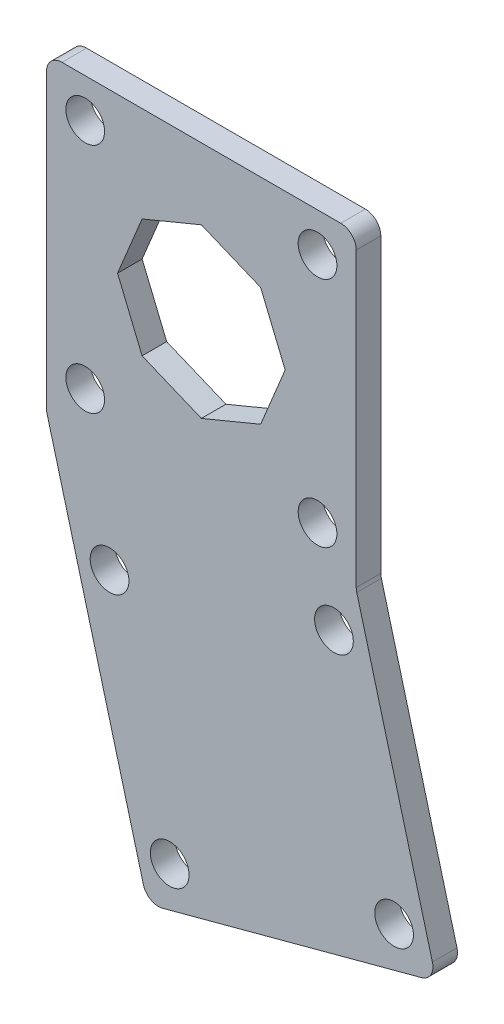
ISO-10303-21;
HEADER;
FILE_DESCRIPTION(('STEP AP214'),'2;1');
FILE_NAME('part.step','',(''),(''),'','','');
FILE_SCHEMA(('AUTOMOTIVE_DESIGN { 1 0 10303 214 1 1 1 1 }'));
ENDSEC;
DATA;
#1=APPLICATION_CONTEXT('core data for automotive mechanical design processes');
#2=APPLICATION_PROTOCOL_DEFINITION('international standard','automotive_design',2000,#1);
#3=PRODUCT_CONTEXT('',#1,'mechanical');
#4=PRODUCT('Part','Part','',(#3));
#5=PRODUCT_RELATED_PRODUCT_CATEGORY('part','',(#4));
#6=PRODUCT_DEFINITION_FORMATION('','',#4);
#7=PRODUCT_DEFINITION_CONTEXT('part definition',#1,'design');
#8=PRODUCT_DEFINITION('design','',#6,#7);
#9=PRODUCT_DEFINITION_SHAPE('','',#8);
#10=(LENGTH_UNIT() NAMED_UNIT(*) SI_UNIT(.MILLI.,.METRE.));
#11=(NAMED_UNIT(*) PLANE_ANGLE_UNIT() SI_UNIT($,.RADIAN.));
#12=(NAMED_UNIT(*) SI_UNIT($,.STERADIAN.) SOLID_ANGLE_UNIT());
#13=UNCERTAINTY_MEASURE_WITH_UNIT(LENGTH_MEASURE(1.E-05),#10,'distance_accuracy_value','');
#14=(GEOMETRIC_REPRESENTATION_CONTEXT(3) GLOBAL_UNCERTAINTY_ASSIGNED_CONTEXT((#13)) GLOBAL_UNIT_ASSIGNED_CONTEXT((#10,
#11,#12)) REPRESENTATION_CONTEXT('',''));
#15=CARTESIAN_POINT('',(0.,0.,0.));
#16=DIRECTION('',(0.,0.,1.));
#17=DIRECTION('',(1.,0.,0.));
#18=AXIS2_PLACEMENT_3D('',#15,#16,#17);
#19=CARTESIAN_POINT('',(0.,0.,3.175));
#20=DIRECTION('',(0.,0.,1.));
#21=DIRECTION('',(1.,0.,0.));
#22=AXIS2_PLACEMENT_3D('',#19,#20,#21);
#23=PLANE('',#22);
#24=CARTESIAN_POINT('',(-4.09047485359226,-62.6896895966552,3.175));
#25=DIRECTION('',(0.,0.,1.));
#26=DIRECTION('',(1.,0.,0.));
#27=AXIS2_PLACEMENT_3D('',#24,#25,#26);
#28=CIRCLE('',#27,2.5);
#29=CARTESIAN_POINT('',(-1.59047485359226,-62.6896895966552,3.175));
#30=VERTEX_POINT('',#29);
#31=EDGE_CURVE('E242',#30,#30,#28,.T.);
#32=ORIENTED_EDGE('',*,*,#31,.F.);
#33=EDGE_LOOP('',(#32));
#34=FACE_BOUND('',#33,.T.);
#35=CARTESIAN_POINT('',(17.1227285820042,-25.9473434549075,3.175));
#36=DIRECTION('',(0.,0.,1.));
#37=DIRECTION('',(1.,0.,0.));
#38=AXIS2_PLACEMENT_3D('',#35,#36,#37);
#39=CIRCLE('',#38,2.5);
#40=CARTESIAN_POINT('',(19.6227285820042,-25.9473434549075,3.175));
#41=VERTEX_POINT('',#40);
#42=EDGE_CURVE('E254',#41,#41,#39,.T.);
#43=ORIENTED_EDGE('',*,*,#42,.F.);
#44=EDGE_LOOP('',(#43));
#45=FACE_BOUND('',#44,.T.);
#46=CARTESIAN_POINT('',(15.,15.,3.175));
#47=DIRECTION('',(0.,0.,1.));
#48=DIRECTION('',(1.,0.,0.));
#49=AXIS2_PLACEMENT_3D('',#46,#47,#48);
#50=CIRCLE('',#49,2.5);
#51=CARTESIAN_POINT('',(17.5,15.,3.175));
#52=VERTEX_POINT('',#51);
#53=EDGE_CURVE('E266',#52,#52,#50,.T.);
#54=ORIENTED_EDGE('',*,*,#53,.F.);
#55=EDGE_LOOP('',(#54));
#56=FACE_BOUND('',#55,.T.);
#57=CARTESIAN_POINT('',(-15.,15.,3.175));
#58=DIRECTION('',(0.,0.,1.));
#59=DIRECTION('',(1.,0.,0.));
#60=AXIS2_PLACEMENT_3D('',#57,#58,#59);
#61=CIRCLE('',#60,2.5);
#62=CARTESIAN_POINT('',(-12.5,15.,3.175));
#63=VERTEX_POINT('',#62);
#64=EDGE_CURVE('E278',#63,#63,#61,.T.);
#65=ORIENTED_EDGE('',*,*,#64,.F.);
#66=EDGE_LOOP('',(#65));
#67=FACE_BOUND('',#66,.T.);
#68=DIRECTION('',(0.965925826289069,0.258819045102519,0.));
#69=VECTOR('',#68,1.);
#70=CARTESIAN_POINT('',(-6.96774627158808,-68.6370330515627,3.175));
#71=LINE('',#70,#69);
#72=CARTESIAN_POINT('',(-5.03589461900994,-68.1193949613576,3.175));
#73=VERTEX_POINT('',#72);
#74=CARTESIAN_POINT('',(28.4209101515226,-59.1546711417678,3.175));
#75=VERTEX_POINT('',#74);
#76=EDGE_CURVE('E297',#73,#75,#71,.T.);
#77=ORIENTED_EDGE('',*,*,#76,.T.);
#78=CARTESIAN_POINT('',(27.9032720613175,-57.2228194891897,3.175));
#79=DIRECTION('',(0.,0.,1.));
#80=DIRECTION('',(1.,0.,0.));
#81=AXIS2_PLACEMENT_3D('',#78,#79,#80);
#82=CIRCLE('',#81,2.);
#83=CARTESIAN_POINT('',(29.8351237138957,-56.7051813989846,3.175));
#84=VERTEX_POINT('',#83);
#85=EDGE_CURVE('E349',#75,#84,#82,.T.);
#86=ORIENTED_EDGE('',*,*,#85,.T.);
#87=DIRECTION('',(-0.258819045102518,0.965925826289069,0.));
#88=VECTOR('',#87,1.);
#89=CARTESIAN_POINT('',(20.,-20.,3.175));
#90=LINE('',#89,#88);
#91=CARTESIAN_POINT('',(20.0681483474219,-20.2543330950303,3.175));
#92=VERTEX_POINT('',#91);
#93=EDGE_CURVE('E300',#84,#92,#90,.T.);
#94=ORIENTED_EDGE('',*,*,#93,.T.);
#95=CARTESIAN_POINT('',(22.,-19.7366950048252,3.175));
#96=DIRECTION('',(0.,0.,1.));
#97=DIRECTION('',(1.,0.,0.));
#98=AXIS2_PLACEMENT_3D('',#95,#96,#97);
#99=CIRCLE('',#98,2.);
#100=CARTESIAN_POINT('',(20.,-19.7366950048252,3.175));
#101=VERTEX_POINT('',#100);
#102=EDGE_CURVE('E11',#92,#101,#99,.F.);
#103=ORIENTED_EDGE('',*,*,#102,.T.);
#104=DIRECTION('',(0.,1.,0.));
#105=VECTOR('',#104,1.);
#106=CARTESIAN_POINT('',(20.,20.,3.175));
#107=LINE('',#106,#105);
#108=CARTESIAN_POINT('',(20.,18.,3.175));
#109=VERTEX_POINT('',#108);
#110=EDGE_CURVE('E303',#101,#109,#107,.T.);
#111=ORIENTED_EDGE('',*,*,#110,.T.);
#112=CARTESIAN_POINT('',(18.,18.,3.175));
#113=DIRECTION('',(0.,0.,1.));
#114=DIRECTION('',(1.,0.,0.));
#115=AXIS2_PLACEMENT_3D('',#112,#113,#114);
#116=CIRCLE('',#115,2.);
#117=CARTESIAN_POINT('',(18.,20.,3.175));
#118=VERTEX_POINT('',#117);
#119=EDGE_CURVE('E55',#109,#118,#116,.T.);
#120=ORIENTED_EDGE('',*,*,#119,.T.);
#121=DIRECTION('',(-1.,0.,0.));
#122=VECTOR('',#121,1.);
#123=CARTESIAN_POINT('',(-20.,20.,3.175));
#124=LINE('',#123,#122);
#125=CARTESIAN_POINT('',(-18.,20.,3.175));
#126=VERTEX_POINT('',#125);
#127=EDGE_CURVE('E305',#118,#126,#124,.T.);
#128=ORIENTED_EDGE('',*,*,#127,.T.);
#129=CARTESIAN_POINT('',(-18.,18.,3.175));
#130=DIRECTION('',(0.,0.,1.));
#131=DIRECTION('',(1.,0.,0.));
#132=AXIS2_PLACEMENT_3D('',#129,#130,#131);
#133=CIRCLE('',#132,2.);
#134=CARTESIAN_POINT('',(-20.,18.,3.175));
#135=VERTEX_POINT('',#134);
#136=EDGE_CURVE('E342',#126,#135,#133,.T.);
#137=ORIENTED_EDGE('',*,*,#136,.T.);
#138=DIRECTION('',(0.,-1.,0.));
#139=VECTOR('',#138,1.);
#140=CARTESIAN_POINT('',(-20.,20.,3.175));
#141=LINE('',#140,#139);
#142=CARTESIAN_POINT('',(-20.,-19.7366950048252,3.175));
#143=VERTEX_POINT('',#142);
#144=EDGE_CURVE('E290',#135,#143,#141,.T.);
#145=ORIENTED_EDGE('',*,*,#144,.T.);
#146=CARTESIAN_POINT('',(-18.,-19.7366950048252,3.175));
#147=DIRECTION('',(0.,0.,1.));
#148=DIRECTION('',(1.,0.,0.));
#149=AXIS2_PLACEMENT_3D('',#146,#147,#148);
#150=CIRCLE('',#149,2.);
#151=CARTESIAN_POINT('',(-19.9318516525781,-20.2543330950302,3.175));
#152=VERTEX_POINT('',#151);
#153=EDGE_CURVE('E345',#143,#152,#150,.T.);
#154=ORIENTED_EDGE('',*,*,#153,.T.);
#155=DIRECTION('',(0.258819045102518,-0.965925826289069,0.));
#156=VECTOR('',#155,1.);
#157=CARTESIAN_POINT('',(-20.,-20.,3.175));
#158=LINE('',#157,#156);
#159=CARTESIAN_POINT('',(-7.48538436179312,-66.7051813989845,3.175));
#160=VERTEX_POINT('',#159);
#161=EDGE_CURVE('E293',#152,#160,#158,.T.);
#162=ORIENTED_EDGE('',*,*,#161,.T.);
#163=CARTESIAN_POINT('',(-5.55353270921498,-66.1875433087795,3.175));
#164=DIRECTION('',(0.,0.,1.));
#165=DIRECTION('',(1.,0.,0.));
#166=AXIS2_PLACEMENT_3D('',#163,#164,#165);
#167=CIRCLE('',#166,2.);
#168=EDGE_CURVE('E347',#160,#73,#167,.T.);
#169=ORIENTED_EDGE('',*,*,#168,.T.);
#170=EDGE_LOOP('',(#77,#86,#94,#103,#111,#120,#128,#137,#145,#154,#162,#169));
#171=FACE_BOUND('',#170,.T.);
#172=CARTESIAN_POINT('',(-11.8550462066679,-33.7119148079831,3.175));
#173=DIRECTION('',(0.,0.,1.));
#174=DIRECTION('',(1.,0.,0.));
#175=AXIS2_PLACEMENT_3D('',#172,#173,#174);
#176=CIRCLE('',#175,2.5);
#177=CARTESIAN_POINT('',(-9.35504620666789,-33.7119148079831,3.175));
#178=VERTEX_POINT('',#177);
#179=EDGE_CURVE('E284',#178,#178,#176,.T.);
#180=ORIENTED_EDGE('',*,*,#179,.F.);
#181=EDGE_LOOP('',(#180));
#182=FACE_BOUND('',#181,.T.);
#183=CARTESIAN_POINT('',(-15.,-15.,3.175));
#184=DIRECTION('',(0.,0.,1.));
#185=DIRECTION('',(1.,0.,0.));
#186=AXIS2_PLACEMENT_3D('',#183,#184,#185);
#187=CIRCLE('',#186,2.5);
#188=CARTESIAN_POINT('',(-12.5,-15.,3.175));
#189=VERTEX_POINT('',#188);
#190=EDGE_CURVE('E272',#189,#189,#187,.T.);
#191=ORIENTED_EDGE('',*,*,#190,.F.);
#192=EDGE_LOOP('',(#191));
#193=FACE_BOUND('',#192,.T.);
#194=CARTESIAN_POINT('',(15.,-15.,3.175));
#195=DIRECTION('',(0.,0.,1.));
#196=DIRECTION('',(1.,0.,0.));
#197=AXIS2_PLACEMENT_3D('',#194,#195,#196);
#198=CIRCLE('',#197,2.5);
#199=CARTESIAN_POINT('',(17.5,-15.,3.175));
#200=VERTEX_POINT('',#199);
#201=EDGE_CURVE('E260',#200,#200,#198,.T.);
#202=ORIENTED_EDGE('',*,*,#201,.F.);
#203=EDGE_LOOP('',(#202));
#204=FACE_BOUND('',#203,.T.);
#205=CARTESIAN_POINT('',(24.8872999350798,-54.9251182435796,3.175));
#206=DIRECTION('',(0.,0.,1.));
#207=DIRECTION('',(1.,0.,0.));
#208=AXIS2_PLACEMENT_3D('',#205,#206,#207);
#209=CIRCLE('',#208,2.5);
#210=CARTESIAN_POINT('',(27.3872999350798,-54.9251182435796,3.175));
#211=VERTEX_POINT('',#210);
#212=EDGE_CURVE('E248',#211,#211,#209,.T.);
#213=ORIENTED_EDGE('',*,*,#212,.F.);
#214=EDGE_LOOP('',(#213));
#215=FACE_BOUND('',#214,.T.);
#216=DIRECTION('',(-0.382683432365096,0.923879532511284,0.));
#217=VECTOR('',#216,1.);
#218=CARTESIAN_POINT('',(10.8239220029239,0.,3.175));
#219=LINE('',#218,#217);
#220=CARTESIAN_POINT('',(10.8239220029239,0.,3.175));
#221=VERTEX_POINT('',#220);
#222=CARTESIAN_POINT('',(7.65366864730174,7.65366864730185,3.175));
#223=VERTEX_POINT('',#222);
#224=EDGE_CURVE('E182',#221,#223,#219,.T.);
#225=ORIENTED_EDGE('',*,*,#224,.F.);
#226=DIRECTION('',(0.382683432365084,0.923879532511289,0.));
#227=VECTOR('',#226,1.);
#228=CARTESIAN_POINT('',(7.65366864730184,-7.65366864730174,3.175));
#229=LINE('',#228,#227);
#230=CARTESIAN_POINT('',(7.65366864730184,-7.65366864730174,3.175));
#231=VERTEX_POINT('',#230);
#232=EDGE_CURVE('E172',#231,#221,#229,.T.);
#233=ORIENTED_EDGE('',*,*,#232,.F.);
#234=DIRECTION('',(0.923879532511284,0.382683432365096,0.));
#235=VECTOR('',#234,1.);
#236=CARTESIAN_POINT('',(0.,-10.8239220029239,3.175));
#237=LINE('',#236,#235);
#238=CARTESIAN_POINT('',(0.,-10.8239220029239,3.175));
#239=VERTEX_POINT('',#238);
#240=EDGE_CURVE('E208',#239,#231,#237,.T.);
#241=ORIENTED_EDGE('',*,*,#240,.F.);
#242=DIRECTION('',(0.923879532511289,-0.382683432365084,0.));
#243=VECTOR('',#242,1.);
#244=CARTESIAN_POINT('',(-7.65366864730175,-7.65366864730184,3.175));
#245=LINE('',#244,#243);
#246=CARTESIAN_POINT('',(-7.65366864730175,-7.65366864730184,3.175));
#247=VERTEX_POINT('',#246);
#248=EDGE_CURVE('E205',#247,#239,#245,.T.);
#249=ORIENTED_EDGE('',*,*,#248,.F.);
#250=DIRECTION('',(0.382683432365096,-0.923879532511284,0.));
#251=VECTOR('',#250,1.);
#252=CARTESIAN_POINT('',(-10.8239220029239,0.,3.175));
#253=LINE('',#252,#251);
#254=CARTESIAN_POINT('',(-10.8239220029239,0.,3.175));
#255=VERTEX_POINT('',#254);
#256=EDGE_CURVE('E203',#255,#247,#253,.T.);
#257=ORIENTED_EDGE('',*,*,#256,.F.);
#258=DIRECTION('',(-0.382683432365084,-0.923879532511289,0.));
#259=VECTOR('',#258,1.);
#260=CARTESIAN_POINT('',(-7.65366864730184,7.65366864730174,3.175));
#261=LINE('',#260,#259);
#262=CARTESIAN_POINT('',(-7.65366864730184,7.65366864730174,3.175));
#263=VERTEX_POINT('',#262);
#264=EDGE_CURVE('E201',#263,#255,#261,.T.);
#265=ORIENTED_EDGE('',*,*,#264,.F.);
#266=DIRECTION('',(-0.923879532511284,-0.382683432365096,0.));
#267=VECTOR('',#266,1.);
#268=CARTESIAN_POINT('',(0.,10.8239220029239,3.175));
#269=LINE('',#268,#267);
#270=CARTESIAN_POINT('',(0.,10.8239220029239,3.175));
#271=VERTEX_POINT('',#270);
#272=EDGE_CURVE('E197',#271,#263,#269,.T.);
#273=ORIENTED_EDGE('',*,*,#272,.F.);
#274=DIRECTION('',(-0.923879532511289,0.382683432365084,0.));
#275=VECTOR('',#274,1.);
#276=CARTESIAN_POINT('',(7.65366864730174,7.65366864730185,3.175));
#277=LINE('',#276,#275);
#278=EDGE_CURVE('E195',#223,#271,#277,.T.);
#279=ORIENTED_EDGE('',*,*,#278,.F.);
#280=EDGE_LOOP('',(#225,#233,#241,#249,#257,#265,#273,#279));
#281=FACE_BOUND('',#280,.T.);
#282=ADVANCED_FACE('F33',(#34,#45,#56,#67,#171,#182,#193,#204,#215,#281),#23,.T.);
#283=CARTESIAN_POINT('',(0.,0.,0.));
#284=DIRECTION('',(0.,0.,1.));
#285=DIRECTION('',(1.,0.,0.));
#286=AXIS2_PLACEMENT_3D('',#283,#284,#285);
#287=PLANE('',#286);
#288=CARTESIAN_POINT('',(-4.09047485359226,-62.6896895966552,0.));
#289=DIRECTION('',(0.,0.,1.));
#290=DIRECTION('',(1.,0.,0.));
#291=AXIS2_PLACEMENT_3D('',#288,#289,#290);
#292=CIRCLE('',#291,2.5);
#293=CARTESIAN_POINT('',(-1.59047485359226,-62.6896895966552,0.));
#294=VERTEX_POINT('',#293);
#295=EDGE_CURVE('E190',#294,#294,#292,.T.);
#296=ORIENTED_EDGE('',*,*,#295,.T.);
#297=EDGE_LOOP('',(#296));
#298=FACE_BOUND('',#297,.T.);
#299=CARTESIAN_POINT('',(17.1227285820042,-25.9473434549075,0.));
#300=DIRECTION('',(0.,0.,1.));
#301=DIRECTION('',(1.,0.,0.));
#302=AXIS2_PLACEMENT_3D('',#299,#300,#301);
#303=CIRCLE('',#302,2.5);
#304=CARTESIAN_POINT('',(19.6227285820042,-25.9473434549075,0.));
#305=VERTEX_POINT('',#304);
#306=EDGE_CURVE('E251',#305,#305,#303,.T.);
#307=ORIENTED_EDGE('',*,*,#306,.T.);
#308=EDGE_LOOP('',(#307));
#309=FACE_BOUND('',#308,.T.);
#310=CARTESIAN_POINT('',(15.,15.,0.));
#311=DIRECTION('',(0.,0.,1.));
#312=DIRECTION('',(1.,0.,0.));
#313=AXIS2_PLACEMENT_3D('',#310,#311,#312);
#314=CIRCLE('',#313,2.5);
#315=CARTESIAN_POINT('',(17.5,15.,0.));
#316=VERTEX_POINT('',#315);
#317=EDGE_CURVE('E263',#316,#316,#314,.T.);
#318=ORIENTED_EDGE('',*,*,#317,.T.);
#319=EDGE_LOOP('',(#318));
#320=FACE_BOUND('',#319,.T.);
#321=CARTESIAN_POINT('',(-15.,15.,0.));
#322=DIRECTION('',(0.,0.,1.));
#323=DIRECTION('',(1.,0.,0.));
#324=AXIS2_PLACEMENT_3D('',#321,#322,#323);
#325=CIRCLE('',#324,2.5);
#326=CARTESIAN_POINT('',(-12.5,15.,0.));
#327=VERTEX_POINT('',#326);
#328=EDGE_CURVE('E275',#327,#327,#325,.T.);
#329=ORIENTED_EDGE('',*,*,#328,.T.);
#330=EDGE_LOOP('',(#329));
#331=FACE_BOUND('',#330,.T.);
#332=DIRECTION('',(-0.258819045102518,0.965925826289069,0.));
#333=VECTOR('',#332,1.);
#334=CARTESIAN_POINT('',(20.,-20.,0.));
#335=LINE('',#334,#333);
#336=CARTESIAN_POINT('',(29.8351237138957,-56.7051813989846,0.));
#337=VERTEX_POINT('',#336);
#338=CARTESIAN_POINT('',(20.0681483474219,-20.2543330950303,0.));
#339=VERTEX_POINT('',#338);
#340=EDGE_CURVE('E316',#337,#339,#335,.T.);
#341=ORIENTED_EDGE('',*,*,#340,.F.);
#342=CARTESIAN_POINT('',(27.9032720613175,-57.2228194891897,0.));
#343=DIRECTION('',(0.,0.,1.));
#344=DIRECTION('',(1.,0.,0.));
#345=AXIS2_PLACEMENT_3D('',#342,#343,#344);
#346=CIRCLE('',#345,2.);
#347=CARTESIAN_POINT('',(28.4209101515226,-59.1546711417678,0.));
#348=VERTEX_POINT('',#347);
#349=EDGE_CURVE('E335',#337,#348,#346,.F.);
#350=ORIENTED_EDGE('',*,*,#349,.T.);
#351=DIRECTION('',(0.965925826289069,0.258819045102519,0.));
#352=VECTOR('',#351,1.);
#353=CARTESIAN_POINT('',(-6.96774627158808,-68.6370330515627,0.));
#354=LINE('',#353,#352);
#355=CARTESIAN_POINT('',(-5.03589461900994,-68.1193949613576,0.));
#356=VERTEX_POINT('',#355);
#357=EDGE_CURVE('E313',#356,#348,#354,.T.);
#358=ORIENTED_EDGE('',*,*,#357,.F.);
#359=CARTESIAN_POINT('',(-5.55353270921498,-66.1875433087795,0.));
#360=DIRECTION('',(0.,0.,1.));
#361=DIRECTION('',(1.,0.,0.));
#362=AXIS2_PLACEMENT_3D('',#359,#360,#361);
#363=CIRCLE('',#362,2.);
#364=CARTESIAN_POINT('',(-7.48538436179312,-66.7051813989845,0.));
#365=VERTEX_POINT('',#364);
#366=EDGE_CURVE('E333',#356,#365,#363,.F.);
#367=ORIENTED_EDGE('',*,*,#366,.T.);
#368=DIRECTION('',(0.258819045102518,-0.965925826289069,0.));
#369=VECTOR('',#368,1.);
#370=CARTESIAN_POINT('',(-20.,-20.,0.));
#371=LINE('',#370,#369);
#372=CARTESIAN_POINT('',(-19.9318516525781,-20.2543330950302,0.));
#373=VERTEX_POINT('',#372);
#374=EDGE_CURVE('E310',#373,#365,#371,.T.);
#375=ORIENTED_EDGE('',*,*,#374,.F.);
#376=CARTESIAN_POINT('',(-18.,-19.7366950048252,0.));
#377=DIRECTION('',(0.,0.,1.));
#378=DIRECTION('',(1.,0.,0.));
#379=AXIS2_PLACEMENT_3D('',#376,#377,#378);
#380=CIRCLE('',#379,2.);
#381=CARTESIAN_POINT('',(-20.,-19.7366950048252,0.));
#382=VERTEX_POINT('',#381);
#383=EDGE_CURVE('E331',#373,#382,#380,.F.);
#384=ORIENTED_EDGE('',*,*,#383,.T.);
#385=DIRECTION('',(0.,-1.,0.));
#386=VECTOR('',#385,1.);
#387=CARTESIAN_POINT('',(-20.,20.,0.));
#388=LINE('',#387,#386);
#389=CARTESIAN_POINT('',(-20.,18.,0.));
#390=VERTEX_POINT('',#389);
#391=EDGE_CURVE('E287',#390,#382,#388,.T.);
#392=ORIENTED_EDGE('',*,*,#391,.F.);
#393=CARTESIAN_POINT('',(-18.,18.,0.));
#394=DIRECTION('',(0.,0.,1.));
#395=DIRECTION('',(1.,0.,0.));
#396=AXIS2_PLACEMENT_3D('',#393,#394,#395);
#397=CIRCLE('',#396,2.);
#398=CARTESIAN_POINT('',(-18.,20.,0.));
#399=VERTEX_POINT('',#398);
#400=EDGE_CURVE('E327',#390,#399,#397,.F.);
#401=ORIENTED_EDGE('',*,*,#400,.T.);
#402=DIRECTION('',(-1.,0.,0.));
#403=VECTOR('',#402,1.);
#404=CARTESIAN_POINT('',(-20.,20.,0.));
#405=LINE('',#404,#403);
#406=CARTESIAN_POINT('',(18.,20.,0.));
#407=VERTEX_POINT('',#406);
#408=EDGE_CURVE('E294',#407,#399,#405,.T.);
#409=ORIENTED_EDGE('',*,*,#408,.F.);
#410=CARTESIAN_POINT('',(18.,18.,0.));
#411=DIRECTION('',(0.,0.,1.));
#412=DIRECTION('',(1.,0.,0.));
#413=AXIS2_PLACEMENT_3D('',#410,#411,#412);
#414=CIRCLE('',#413,2.);
#415=CARTESIAN_POINT('',(20.,18.,0.));
#416=VERTEX_POINT('',#415);
#417=EDGE_CURVE('E329',#407,#416,#414,.F.);
#418=ORIENTED_EDGE('',*,*,#417,.T.);
#419=DIRECTION('',(0.,1.,0.));
#420=VECTOR('',#419,1.);
#421=CARTESIAN_POINT('',(20.,20.,0.));
#422=LINE('',#421,#420);
#423=CARTESIAN_POINT('',(20.,-19.7366950048252,0.));
#424=VERTEX_POINT('',#423);
#425=EDGE_CURVE('E319',#424,#416,#422,.T.);
#426=ORIENTED_EDGE('',*,*,#425,.F.);
#427=CARTESIAN_POINT('',(22.,-19.7366950048252,0.));
#428=DIRECTION('',(0.,0.,1.));
#429=DIRECTION('',(1.,0.,0.));
#430=AXIS2_PLACEMENT_3D('',#427,#428,#429);
#431=CIRCLE('',#430,2.);
#432=EDGE_CURVE('E41',#424,#339,#431,.T.);
#433=ORIENTED_EDGE('',*,*,#432,.T.);
#434=EDGE_LOOP('',(#341,#350,#358,#367,#375,#384,#392,#401,#409,#418,#426,#433));
#435=FACE_BOUND('',#434,.T.);
#436=CARTESIAN_POINT('',(-11.8550462066679,-33.7119148079831,0.));
#437=DIRECTION('',(0.,0.,1.));
#438=DIRECTION('',(1.,0.,0.));
#439=AXIS2_PLACEMENT_3D('',#436,#437,#438);
#440=CIRCLE('',#439,2.5);
#441=CARTESIAN_POINT('',(-9.35504620666789,-33.7119148079831,0.));
#442=VERTEX_POINT('',#441);
#443=EDGE_CURVE('E281',#442,#442,#440,.T.);
#444=ORIENTED_EDGE('',*,*,#443,.T.);
#445=EDGE_LOOP('',(#444));
#446=FACE_BOUND('',#445,.T.);
#447=CARTESIAN_POINT('',(-15.,-15.,0.));
#448=DIRECTION('',(0.,0.,1.));
#449=DIRECTION('',(1.,0.,0.));
#450=AXIS2_PLACEMENT_3D('',#447,#448,#449);
#451=CIRCLE('',#450,2.5);
#452=CARTESIAN_POINT('',(-12.5,-15.,0.));
#453=VERTEX_POINT('',#452);
#454=EDGE_CURVE('E269',#453,#453,#451,.T.);
#455=ORIENTED_EDGE('',*,*,#454,.T.);
#456=EDGE_LOOP('',(#455));
#457=FACE_BOUND('',#456,.T.);
#458=CARTESIAN_POINT('',(15.,-15.,0.));
#459=DIRECTION('',(0.,0.,1.));
#460=DIRECTION('',(1.,0.,0.));
#461=AXIS2_PLACEMENT_3D('',#458,#459,#460);
#462=CIRCLE('',#461,2.5);
#463=CARTESIAN_POINT('',(17.5,-15.,0.));
#464=VERTEX_POINT('',#463);
#465=EDGE_CURVE('E257',#464,#464,#462,.T.);
#466=ORIENTED_EDGE('',*,*,#465,.T.);
#467=EDGE_LOOP('',(#466));
#468=FACE_BOUND('',#467,.T.);
#469=CARTESIAN_POINT('',(24.8872999350798,-54.9251182435796,0.));
#470=DIRECTION('',(0.,0.,1.));
#471=DIRECTION('',(1.,0.,0.));
#472=AXIS2_PLACEMENT_3D('',#469,#470,#471);
#473=CIRCLE('',#472,2.5);
#474=CARTESIAN_POINT('',(27.3872999350798,-54.9251182435796,0.));
#475=VERTEX_POINT('',#474);
#476=EDGE_CURVE('E245',#475,#475,#473,.T.);
#477=ORIENTED_EDGE('',*,*,#476,.T.);
#478=EDGE_LOOP('',(#477));
#479=FACE_BOUND('',#478,.T.);
#480=DIRECTION('',(0.382683432365084,0.923879532511289,0.));
#481=VECTOR('',#480,1.);
#482=CARTESIAN_POINT('',(7.65366864730184,-7.65366864730174,0.));
#483=LINE('',#482,#481);
#484=CARTESIAN_POINT('',(7.65366864730184,-7.65366864730174,0.));
#485=VERTEX_POINT('',#484);
#486=CARTESIAN_POINT('',(10.8239220029239,0.,0.));
#487=VERTEX_POINT('',#486);
#488=EDGE_CURVE('E210',#485,#487,#483,.T.);
#489=ORIENTED_EDGE('',*,*,#488,.T.);
#490=DIRECTION('',(-0.382683432365096,0.923879532511284,0.));
#491=VECTOR('',#490,1.);
#492=CARTESIAN_POINT('',(10.8239220029239,0.,0.));
#493=LINE('',#492,#491);
#494=CARTESIAN_POINT('',(7.65366864730174,7.65366864730185,0.));
#495=VERTEX_POINT('',#494);
#496=EDGE_CURVE('E189',#487,#495,#493,.T.);
#497=ORIENTED_EDGE('',*,*,#496,.T.);
#498=DIRECTION('',(-0.923879532511289,0.382683432365084,0.));
#499=VECTOR('',#498,1.);
#500=CARTESIAN_POINT('',(7.65366864730174,7.65366864730185,0.));
#501=LINE('',#500,#499);
#502=CARTESIAN_POINT('',(0.,10.8239220029239,0.));
#503=VERTEX_POINT('',#502);
#504=EDGE_CURVE('E213',#495,#503,#501,.T.);
#505=ORIENTED_EDGE('',*,*,#504,.T.);
#506=DIRECTION('',(-0.923879532511284,-0.382683432365096,0.));
#507=VECTOR('',#506,1.);
#508=CARTESIAN_POINT('',(0.,10.8239220029239,0.));
#509=LINE('',#508,#507);
#510=CARTESIAN_POINT('',(-7.65366864730184,7.65366864730174,0.));
#511=VERTEX_POINT('',#510);
#512=EDGE_CURVE('E216',#503,#511,#509,.T.);
#513=ORIENTED_EDGE('',*,*,#512,.T.);
#514=DIRECTION('',(-0.382683432365084,-0.923879532511289,0.));
#515=VECTOR('',#514,1.);
#516=CARTESIAN_POINT('',(-7.65366864730184,7.65366864730174,0.));
#517=LINE('',#516,#515);
#518=CARTESIAN_POINT('',(-10.8239220029239,0.,0.));
#519=VERTEX_POINT('',#518);
#520=EDGE_CURVE('E219',#511,#519,#517,.T.);
#521=ORIENTED_EDGE('',*,*,#520,.T.);
#522=DIRECTION('',(0.382683432365096,-0.923879532511284,0.));
#523=VECTOR('',#522,1.);
#524=CARTESIAN_POINT('',(-10.8239220029239,0.,0.));
#525=LINE('',#524,#523);
#526=CARTESIAN_POINT('',(-7.65366864730175,-7.65366864730184,0.));
#527=VERTEX_POINT('',#526);
#528=EDGE_CURVE('E222',#519,#527,#525,.T.);
#529=ORIENTED_EDGE('',*,*,#528,.T.);
#530=DIRECTION('',(0.923879532511289,-0.382683432365084,0.));
#531=VECTOR('',#530,1.);
#532=CARTESIAN_POINT('',(-7.65366864730175,-7.65366864730184,0.));
#533=LINE('',#532,#531);
#534=CARTESIAN_POINT('',(0.,-10.8239220029239,0.));
#535=VERTEX_POINT('',#534);
#536=EDGE_CURVE('E225',#527,#535,#533,.T.);
#537=ORIENTED_EDGE('',*,*,#536,.T.);
#538=DIRECTION('',(0.923879532511284,0.382683432365096,0.));
#539=VECTOR('',#538,1.);
#540=CARTESIAN_POINT('',(0.,-10.8239220029239,0.));
#541=LINE('',#540,#539);
#542=EDGE_CURVE('E183',#535,#485,#541,.T.);
#543=ORIENTED_EDGE('',*,*,#542,.T.);
#544=EDGE_LOOP('',(#489,#497,#505,#513,#521,#529,#537,#543));
#545=FACE_BOUND('',#544,.T.);
#546=ADVANCED_FACE('F372',(#298,#309,#320,#331,#435,#446,#457,#468,#479,#545),#287,.F.);
#547=CARTESIAN_POINT('',(-20.,20.,3.175));
#548=DIRECTION('',(1.,0.,0.));
#549=DIRECTION('',(0.,1.,0.));
#550=AXIS2_PLACEMENT_3D('',#547,#548,#549);
#551=PLANE('',#550);
#552=ORIENTED_EDGE('',*,*,#391,.T.);
#553=DIRECTION('',(0.,0.,-1.));
#554=VECTOR('',#553,1.);
#555=CARTESIAN_POINT('',(-20.,-19.7366950048252,3.175));
#556=LINE('',#555,#554);
#557=EDGE_CURVE('E359',#382,#143,#556,.F.);
#558=ORIENTED_EDGE('',*,*,#557,.T.);
#559=ORIENTED_EDGE('',*,*,#144,.F.);
#560=DIRECTION('',(0.,0.,-1.));
#561=VECTOR('',#560,1.);
#562=CARTESIAN_POINT('',(-20.,18.,3.175));
#563=LINE('',#562,#561);
#564=EDGE_CURVE('E356',#135,#390,#563,.T.);
#565=ORIENTED_EDGE('',*,*,#564,.T.);
#566=EDGE_LOOP('',(#552,#558,#559,#565));
#567=FACE_BOUND('',#566,.T.);
#568=ADVANCED_FACE('F399',(#567),#551,.F.);
#569=CARTESIAN_POINT('',(-20.,-20.,3.175));
#570=DIRECTION('',(0.965925826289069,0.258819045102518,0.));
#571=DIRECTION('',(-0.258819045102519,0.965925826289069,0.));
#572=AXIS2_PLACEMENT_3D('',#569,#570,#571);
#573=PLANE('',#572);
#574=ORIENTED_EDGE('',*,*,#374,.T.);
#575=DIRECTION('',(0.,0.,-1.));
#576=VECTOR('',#575,1.);
#577=CARTESIAN_POINT('',(-7.48538436179312,-66.7051813989845,3.175));
#578=LINE('',#577,#576);
#579=EDGE_CURVE('E354',#365,#160,#578,.F.);
#580=ORIENTED_EDGE('',*,*,#579,.T.);
#581=ORIENTED_EDGE('',*,*,#161,.F.);
#582=DIRECTION('',(0.,0.,-1.));
#583=VECTOR('',#582,1.);
#584=CARTESIAN_POINT('',(-19.9318516525781,-20.2543330950302,3.175));
#585=LINE('',#584,#583);
#586=EDGE_CURVE('E351',#152,#373,#585,.T.);
#587=ORIENTED_EDGE('',*,*,#586,.T.);
#588=EDGE_LOOP('',(#574,#580,#581,#587));
#589=FACE_BOUND('',#588,.T.);
#590=ADVANCED_FACE('F408',(#589),#573,.F.);
#591=CARTESIAN_POINT('',(-6.96774627158808,-68.6370330515627,3.175));
#592=DIRECTION('',(-0.258819045102519,0.965925826289069,0.));
#593=DIRECTION('',(-0.965925826289069,-0.258819045102519,0.));
#594=AXIS2_PLACEMENT_3D('',#591,#592,#593);
#595=PLANE('',#594);
#596=ORIENTED_EDGE('',*,*,#357,.T.);
#597=DIRECTION('',(0.,0.,-1.));
#598=VECTOR('',#597,1.);
#599=CARTESIAN_POINT('',(28.4209101515226,-59.1546711417678,3.175));
#600=LINE('',#599,#598);
#601=EDGE_CURVE('E340',#348,#75,#600,.F.);
#602=ORIENTED_EDGE('',*,*,#601,.T.);
#603=ORIENTED_EDGE('',*,*,#76,.F.);
#604=DIRECTION('',(0.,0.,-1.));
#605=VECTOR('',#604,1.);
#606=CARTESIAN_POINT('',(-5.03589461900994,-68.1193949613576,3.175));
#607=LINE('',#606,#605);
#608=EDGE_CURVE('E337',#73,#356,#607,.T.);
#609=ORIENTED_EDGE('',*,*,#608,.T.);
#610=EDGE_LOOP('',(#596,#602,#603,#609));
#611=FACE_BOUND('',#610,.T.);
#612=ADVANCED_FACE('F417',(#611),#595,.F.);
#613=CARTESIAN_POINT('',(20.,-20.,3.175));
#614=DIRECTION('',(-0.965925826289069,-0.258819045102518,0.));
#615=DIRECTION('',(0.258819045102518,-0.965925826289069,0.));
#616=AXIS2_PLACEMENT_3D('',#613,#614,#615);
#617=PLANE('',#616);
#618=ORIENTED_EDGE('',*,*,#93,.F.);
#619=DIRECTION('',(0.,0.,-1.));
#620=VECTOR('',#619,1.);
#621=CARTESIAN_POINT('',(29.8351237138957,-56.7051813989846,3.175));
#622=LINE('',#621,#620);
#623=EDGE_CURVE('E324',#84,#337,#622,.T.);
#624=ORIENTED_EDGE('',*,*,#623,.T.);
#625=ORIENTED_EDGE('',*,*,#340,.T.);
#626=DIRECTION('',(0.,0.,-1.));
#627=VECTOR('',#626,1.);
#628=CARTESIAN_POINT('',(20.0681483474219,-20.2543330950303,3.175));
#629=LINE('',#628,#627);
#630=EDGE_CURVE('E307',#339,#92,#629,.F.);
#631=ORIENTED_EDGE('',*,*,#630,.T.);
#632=EDGE_LOOP('',(#618,#624,#625,#631));
#633=FACE_BOUND('',#632,.T.);
#634=ADVANCED_FACE('F379',(#633),#617,.F.);
#635=CARTESIAN_POINT('',(20.,20.,3.175));
#636=DIRECTION('',(-1.,0.,0.));
#637=DIRECTION('',(0.,-1.,0.));
#638=AXIS2_PLACEMENT_3D('',#635,#636,#637);
#639=PLANE('',#638);
#640=ORIENTED_EDGE('',*,*,#110,.F.);
#641=DIRECTION('',(0.,0.,-1.));
#642=VECTOR('',#641,1.);
#643=CARTESIAN_POINT('',(20.,-19.7366950048252,0.));
#644=LINE('',#643,#642);
#645=EDGE_CURVE('E363',#101,#424,#644,.T.);
#646=ORIENTED_EDGE('',*,*,#645,.T.);
#647=ORIENTED_EDGE('',*,*,#425,.T.);
#648=DIRECTION('',(0.,0.,-1.));
#649=VECTOR('',#648,1.);
#650=CARTESIAN_POINT('',(20.,18.,3.175));
#651=LINE('',#650,#649);
#652=EDGE_CURVE('E361',#416,#109,#651,.F.);
#653=ORIENTED_EDGE('',*,*,#652,.T.);
#654=EDGE_LOOP('',(#640,#646,#647,#653));
#655=FACE_BOUND('',#654,.T.);
#656=ADVANCED_FACE('F386',(#655),#639,.F.);
#657=CARTESIAN_POINT('',(-20.,20.,3.175));
#658=DIRECTION('',(0.,-1.,0.));
#659=DIRECTION('',(0.,0.,-1.));
#660=AXIS2_PLACEMENT_3D('',#657,#658,#659);
#661=PLANE('',#660);
#662=ORIENTED_EDGE('',*,*,#127,.F.);
#663=DIRECTION('',(0.,0.,-1.));
#664=VECTOR('',#663,1.);
#665=CARTESIAN_POINT('',(18.,20.,3.175));
#666=LINE('',#665,#664);
#667=EDGE_CURVE('E367',#118,#407,#666,.T.);
#668=ORIENTED_EDGE('',*,*,#667,.T.);
#669=ORIENTED_EDGE('',*,*,#408,.T.);
#670=DIRECTION('',(0.,0.,-1.));
#671=VECTOR('',#670,1.);
#672=CARTESIAN_POINT('',(-18.,20.,3.175));
#673=LINE('',#672,#671);
#674=EDGE_CURVE('E48',#399,#126,#673,.F.);
#675=ORIENTED_EDGE('',*,*,#674,.T.);
#676=EDGE_LOOP('',(#662,#668,#669,#675));
#677=FACE_BOUND('',#676,.T.);
#678=ADVANCED_FACE('F392',(#677),#661,.F.);
#679=CARTESIAN_POINT('',(-11.8550462066679,-33.7119148079831,3.175));
#680=DIRECTION('',(0.,0.,-1.));
#681=DIRECTION('',(-1.,0.,0.));
#682=AXIS2_PLACEMENT_3D('',#679,#680,#681);
#683=CYLINDRICAL_SURFACE('',#682,2.5);
#684=ORIENTED_EDGE('',*,*,#179,.T.);
#685=EDGE_LOOP('',(#684));
#686=FACE_BOUND('',#685,.T.);
#687=ORIENTED_EDGE('',*,*,#443,.F.);
#688=EDGE_LOOP('',(#687));
#689=FACE_BOUND('',#688,.T.);
#690=ADVANCED_FACE('F445',(#686,#689),#683,.F.);
#691=CARTESIAN_POINT('',(-15.,15.,3.175));
#692=DIRECTION('',(0.,0.,-1.));
#693=DIRECTION('',(-1.,0.,0.));
#694=AXIS2_PLACEMENT_3D('',#691,#692,#693);
#695=CYLINDRICAL_SURFACE('',#694,2.5);
#696=ORIENTED_EDGE('',*,*,#64,.T.);
#697=EDGE_LOOP('',(#696));
#698=FACE_BOUND('',#697,.T.);
#699=ORIENTED_EDGE('',*,*,#328,.F.);
#700=EDGE_LOOP('',(#699));
#701=FACE_BOUND('',#700,.T.);
#702=ADVANCED_FACE('F488',(#698,#701),#695,.F.);
#703=CARTESIAN_POINT('',(-15.,-15.,3.175));
#704=DIRECTION('',(0.,0.,-1.));
#705=DIRECTION('',(-1.,0.,0.));
#706=AXIS2_PLACEMENT_3D('',#703,#704,#705);
#707=CYLINDRICAL_SURFACE('',#706,2.5);
#708=ORIENTED_EDGE('',*,*,#190,.T.);
#709=EDGE_LOOP('',(#708));
#710=FACE_BOUND('',#709,.T.);
#711=ORIENTED_EDGE('',*,*,#454,.F.);
#712=EDGE_LOOP('',(#711));
#713=FACE_BOUND('',#712,.T.);
#714=ADVANCED_FACE('F495',(#710,#713),#707,.F.);
#715=CARTESIAN_POINT('',(15.,15.,3.175));
#716=DIRECTION('',(0.,0.,-1.));
#717=DIRECTION('',(-1.,0.,0.));
#718=AXIS2_PLACEMENT_3D('',#715,#716,#717);
#719=CYLINDRICAL_SURFACE('',#718,2.5);
#720=ORIENTED_EDGE('',*,*,#53,.T.);
#721=EDGE_LOOP('',(#720));
#722=FACE_BOUND('',#721,.T.);
#723=ORIENTED_EDGE('',*,*,#317,.F.);
#724=EDGE_LOOP('',(#723));
#725=FACE_BOUND('',#724,.T.);
#726=ADVANCED_FACE('F502',(#722,#725),#719,.F.);
#727=CARTESIAN_POINT('',(15.,-15.,3.175));
#728=DIRECTION('',(0.,0.,-1.));
#729=DIRECTION('',(-1.,0.,0.));
#730=AXIS2_PLACEMENT_3D('',#727,#728,#729);
#731=CYLINDRICAL_SURFACE('',#730,2.5);
#732=ORIENTED_EDGE('',*,*,#201,.T.);
#733=EDGE_LOOP('',(#732));
#734=FACE_BOUND('',#733,.T.);
#735=ORIENTED_EDGE('',*,*,#465,.F.);
#736=EDGE_LOOP('',(#735));
#737=FACE_BOUND('',#736,.T.);
#738=ADVANCED_FACE('F510',(#734,#737),#731,.F.);
#739=CARTESIAN_POINT('',(17.1227285820042,-25.9473434549075,3.175));
#740=DIRECTION('',(0.,0.,-1.));
#741=DIRECTION('',(-1.,0.,0.));
#742=AXIS2_PLACEMENT_3D('',#739,#740,#741);
#743=CYLINDRICAL_SURFACE('',#742,2.5);
#744=ORIENTED_EDGE('',*,*,#42,.T.);
#745=EDGE_LOOP('',(#744));
#746=FACE_BOUND('',#745,.T.);
#747=ORIENTED_EDGE('',*,*,#306,.F.);
#748=EDGE_LOOP('',(#747));
#749=FACE_BOUND('',#748,.T.);
#750=ADVANCED_FACE('F518',(#746,#749),#743,.F.);
#751=CARTESIAN_POINT('',(24.8872999350798,-54.9251182435796,3.175));
#752=DIRECTION('',(0.,0.,-1.));
#753=DIRECTION('',(-1.,0.,0.));
#754=AXIS2_PLACEMENT_3D('',#751,#752,#753);
#755=CYLINDRICAL_SURFACE('',#754,2.5);
#756=ORIENTED_EDGE('',*,*,#212,.T.);
#757=EDGE_LOOP('',(#756));
#758=FACE_BOUND('',#757,.T.);
#759=ORIENTED_EDGE('',*,*,#476,.F.);
#760=EDGE_LOOP('',(#759));
#761=FACE_BOUND('',#760,.T.);
#762=ADVANCED_FACE('F526',(#758,#761),#755,.F.);
#763=CARTESIAN_POINT('',(-4.09047485359226,-62.6896895966552,3.175));
#764=DIRECTION('',(0.,0.,-1.));
#765=DIRECTION('',(-1.,0.,0.));
#766=AXIS2_PLACEMENT_3D('',#763,#764,#765);
#767=CYLINDRICAL_SURFACE('',#766,2.5);
#768=ORIENTED_EDGE('',*,*,#31,.T.);
#769=EDGE_LOOP('',(#768));
#770=FACE_BOUND('',#769,.T.);
#771=ORIENTED_EDGE('',*,*,#295,.F.);
#772=EDGE_LOOP('',(#771));
#773=FACE_BOUND('',#772,.T.);
#774=ADVANCED_FACE('F534',(#770,#773),#767,.F.);
#775=CARTESIAN_POINT('',(7.65366864730184,-7.65366864730174,3.175));
#776=DIRECTION('',(-0.923879532511289,0.382683432365084,0.));
#777=DIRECTION('',(-0.382683432365084,-0.923879532511289,0.));
#778=AXIS2_PLACEMENT_3D('',#775,#776,#777);
#779=PLANE('',#778);
#780=ORIENTED_EDGE('',*,*,#488,.F.);
#781=DIRECTION('',(0.,0.,-1.));
#782=VECTOR('',#781,1.);
#783=CARTESIAN_POINT('',(7.65366864730184,-7.65366864730174,3.175));
#784=LINE('',#783,#782);
#785=EDGE_CURVE('E178',#231,#485,#784,.T.);
#786=ORIENTED_EDGE('',*,*,#785,.F.);
#787=ORIENTED_EDGE('',*,*,#232,.T.);
#788=DIRECTION('',(0.,0.,-1.));
#789=VECTOR('',#788,1.);
#790=CARTESIAN_POINT('',(10.8239220029239,0.,3.175));
#791=LINE('',#790,#789);
#792=EDGE_CURVE('E175',#221,#487,#791,.T.);
#793=ORIENTED_EDGE('',*,*,#792,.T.);
#794=EDGE_LOOP('',(#780,#786,#787,#793));
#795=FACE_BOUND('',#794,.T.);
#796=ADVANCED_FACE('F174',(#795),#779,.T.);
#797=CARTESIAN_POINT('',(10.8239220029239,0.,3.175));
#798=DIRECTION('',(-0.923879532511284,-0.382683432365096,0.));
#799=DIRECTION('',(0.382683432365096,-0.923879532511284,0.));
#800=AXIS2_PLACEMENT_3D('',#797,#798,#799);
#801=PLANE('',#800);
#802=ORIENTED_EDGE('',*,*,#496,.F.);
#803=ORIENTED_EDGE('',*,*,#792,.F.);
#804=ORIENTED_EDGE('',*,*,#224,.T.);
#805=DIRECTION('',(0.,0.,-1.));
#806=VECTOR('',#805,1.);
#807=CARTESIAN_POINT('',(7.65366864730174,7.65366864730185,3.175));
#808=LINE('',#807,#806);
#809=EDGE_CURVE('E191',#223,#495,#808,.T.);
#810=ORIENTED_EDGE('',*,*,#809,.T.);
#811=EDGE_LOOP('',(#802,#803,#804,#810));
#812=FACE_BOUND('',#811,.T.);
#813=ADVANCED_FACE('F186',(#812),#801,.T.);
#814=CARTESIAN_POINT('',(7.65366864730174,7.65366864730185,3.175));
#815=DIRECTION('',(-0.382683432365084,-0.923879532511289,0.));
#816=DIRECTION('',(0.923879532511289,-0.382683432365084,0.));
#817=AXIS2_PLACEMENT_3D('',#814,#815,#816);
#818=PLANE('',#817);
#819=ORIENTED_EDGE('',*,*,#504,.F.);
#820=ORIENTED_EDGE('',*,*,#809,.F.);
#821=ORIENTED_EDGE('',*,*,#278,.T.);
#822=DIRECTION('',(0.,0.,-1.));
#823=VECTOR('',#822,1.);
#824=CARTESIAN_POINT('',(0.,10.8239220029239,3.175));
#825=LINE('',#824,#823);
#826=EDGE_CURVE('E239',#271,#503,#825,.T.);
#827=ORIENTED_EDGE('',*,*,#826,.T.);
#828=EDGE_LOOP('',(#819,#820,#821,#827));
#829=FACE_BOUND('',#828,.T.);
#830=ADVANCED_FACE('F555',(#829),#818,.T.);
#831=CARTESIAN_POINT('',(0.,10.8239220029239,3.175));
#832=DIRECTION('',(0.382683432365096,-0.923879532511284,0.));
#833=DIRECTION('',(0.923879532511284,0.382683432365096,0.));
#834=AXIS2_PLACEMENT_3D('',#831,#832,#833);
#835=PLANE('',#834);
#836=ORIENTED_EDGE('',*,*,#512,.F.);
#837=ORIENTED_EDGE('',*,*,#826,.F.);
#838=ORIENTED_EDGE('',*,*,#272,.T.);
#839=DIRECTION('',(0.,0.,-1.));
#840=VECTOR('',#839,1.);
#841=CARTESIAN_POINT('',(-7.65366864730184,7.65366864730174,3.175));
#842=LINE('',#841,#840);
#843=EDGE_CURVE('E237',#263,#511,#842,.T.);
#844=ORIENTED_EDGE('',*,*,#843,.T.);
#845=EDGE_LOOP('',(#836,#837,#838,#844));
#846=FACE_BOUND('',#845,.T.);
#847=ADVANCED_FACE('F562',(#846),#835,.T.);
#848=CARTESIAN_POINT('',(-7.65366864730184,7.65366864730174,3.175));
#849=DIRECTION('',(0.923879532511289,-0.382683432365084,0.));
#850=DIRECTION('',(0.382683432365084,0.923879532511289,0.));
#851=AXIS2_PLACEMENT_3D('',#848,#849,#850);
#852=PLANE('',#851);
#853=ORIENTED_EDGE('',*,*,#520,.F.);
#854=ORIENTED_EDGE('',*,*,#843,.F.);
#855=ORIENTED_EDGE('',*,*,#264,.T.);
#856=DIRECTION('',(0.,0.,-1.));
#857=VECTOR('',#856,1.);
#858=CARTESIAN_POINT('',(-10.8239220029239,0.,3.175));
#859=LINE('',#858,#857);
#860=EDGE_CURVE('E235',#255,#519,#859,.T.);
#861=ORIENTED_EDGE('',*,*,#860,.T.);
#862=EDGE_LOOP('',(#853,#854,#855,#861));
#863=FACE_BOUND('',#862,.T.);
#864=ADVANCED_FACE('F570',(#863),#852,.T.);
#865=CARTESIAN_POINT('',(-10.8239220029239,0.,3.175));
#866=DIRECTION('',(0.923879532511284,0.382683432365096,0.));
#867=DIRECTION('',(-0.382683432365096,0.923879532511285,0.));
#868=AXIS2_PLACEMENT_3D('',#865,#866,#867);
#869=PLANE('',#868);
#870=ORIENTED_EDGE('',*,*,#528,.F.);
#871=ORIENTED_EDGE('',*,*,#860,.F.);
#872=ORIENTED_EDGE('',*,*,#256,.T.);
#873=DIRECTION('',(0.,0.,-1.));
#874=VECTOR('',#873,1.);
#875=CARTESIAN_POINT('',(-7.65366864730175,-7.65366864730184,3.175));
#876=LINE('',#875,#874);
#877=EDGE_CURVE('E233',#247,#527,#876,.T.);
#878=ORIENTED_EDGE('',*,*,#877,.T.);
#879=EDGE_LOOP('',(#870,#871,#872,#878));
#880=FACE_BOUND('',#879,.T.);
#881=ADVANCED_FACE('F578',(#880),#869,.T.);
#882=CARTESIAN_POINT('',(-7.65366864730175,-7.65366864730184,3.175));
#883=DIRECTION('',(0.382683432365084,0.923879532511289,0.));
#884=DIRECTION('',(-0.923879532511289,0.382683432365084,0.));
#885=AXIS2_PLACEMENT_3D('',#882,#883,#884);
#886=PLANE('',#885);
#887=ORIENTED_EDGE('',*,*,#536,.F.);
#888=ORIENTED_EDGE('',*,*,#877,.F.);
#889=ORIENTED_EDGE('',*,*,#248,.T.);
#890=DIRECTION('',(0.,0.,-1.));
#891=VECTOR('',#890,1.);
#892=CARTESIAN_POINT('',(0.,-10.8239220029239,3.175));
#893=LINE('',#892,#891);
#894=EDGE_CURVE('E231',#239,#535,#893,.T.);
#895=ORIENTED_EDGE('',*,*,#894,.T.);
#896=EDGE_LOOP('',(#887,#888,#889,#895));
#897=FACE_BOUND('',#896,.T.);
#898=ADVANCED_FACE('F430',(#897),#886,.T.);
#899=CARTESIAN_POINT('',(0.,-10.8239220029239,3.175));
#900=DIRECTION('',(-0.382683432365096,0.923879532511284,0.));
#901=DIRECTION('',(-0.923879532511284,-0.382683432365096,0.));
#902=AXIS2_PLACEMENT_3D('',#899,#900,#901);
#903=PLANE('',#902);
#904=ORIENTED_EDGE('',*,*,#542,.F.);
#905=ORIENTED_EDGE('',*,*,#894,.F.);
#906=ORIENTED_EDGE('',*,*,#240,.T.);
#907=ORIENTED_EDGE('',*,*,#785,.T.);
#908=EDGE_LOOP('',(#904,#905,#906,#907));
#909=FACE_BOUND('',#908,.T.);
#910=ADVANCED_FACE('F423',(#909),#903,.T.);
#911=CARTESIAN_POINT('',(27.9032720613175,-57.2228194891897,3.175));
#912=DIRECTION('',(0.,0.,-1.));
#913=DIRECTION('',(-1.,0.,0.));
#914=AXIS2_PLACEMENT_3D('',#911,#912,#913);
#915=CYLINDRICAL_SURFACE('',#914,2.);
#916=ORIENTED_EDGE('',*,*,#85,.F.);
#917=ORIENTED_EDGE('',*,*,#601,.F.);
#918=ORIENTED_EDGE('',*,*,#349,.F.);
#919=ORIENTED_EDGE('',*,*,#623,.F.);
#920=EDGE_LOOP('',(#916,#917,#918,#919));
#921=FACE_BOUND('',#920,.T.);
#922=ADVANCED_FACE('F421',(#921),#915,.T.);
#923=CARTESIAN_POINT('',(-5.55353270921498,-66.1875433087795,3.175));
#924=DIRECTION('',(0.,0.,-1.));
#925=DIRECTION('',(-1.,0.,0.));
#926=AXIS2_PLACEMENT_3D('',#923,#924,#925);
#927=CYLINDRICAL_SURFACE('',#926,2.);
#928=ORIENTED_EDGE('',*,*,#168,.F.);
#929=ORIENTED_EDGE('',*,*,#579,.F.);
#930=ORIENTED_EDGE('',*,*,#366,.F.);
#931=ORIENTED_EDGE('',*,*,#608,.F.);
#932=EDGE_LOOP('',(#928,#929,#930,#931));
#933=FACE_BOUND('',#932,.T.);
#934=ADVANCED_FACE('F414',(#933),#927,.T.);
#935=CARTESIAN_POINT('',(-18.,-19.7366950048252,3.175));
#936=DIRECTION('',(0.,0.,-1.));
#937=DIRECTION('',(-1.,0.,0.));
#938=AXIS2_PLACEMENT_3D('',#935,#936,#937);
#939=CYLINDRICAL_SURFACE('',#938,2.);
#940=ORIENTED_EDGE('',*,*,#153,.F.);
#941=ORIENTED_EDGE('',*,*,#557,.F.);
#942=ORIENTED_EDGE('',*,*,#383,.F.);
#943=ORIENTED_EDGE('',*,*,#586,.F.);
#944=EDGE_LOOP('',(#940,#941,#942,#943));
#945=FACE_BOUND('',#944,.T.);
#946=ADVANCED_FACE('F405',(#945),#939,.T.);
#947=CARTESIAN_POINT('',(22.,-19.7366950048252,3.175));
#948=DIRECTION('',(0.,0.,1.));
#949=DIRECTION('',(1.,0.,0.));
#950=AXIS2_PLACEMENT_3D('',#947,#948,#949);
#951=CYLINDRICAL_SURFACE('',#950,2.);
#952=ORIENTED_EDGE('',*,*,#102,.F.);
#953=ORIENTED_EDGE('',*,*,#630,.F.);
#954=ORIENTED_EDGE('',*,*,#432,.F.);
#955=ORIENTED_EDGE('',*,*,#645,.F.);
#956=EDGE_LOOP('',(#952,#953,#954,#955));
#957=FACE_BOUND('',#956,.T.);
#958=ADVANCED_FACE('F382',(#957),#951,.F.);
#959=CARTESIAN_POINT('',(18.,18.,3.175));
#960=DIRECTION('',(0.,0.,-1.));
#961=DIRECTION('',(-1.,0.,0.));
#962=AXIS2_PLACEMENT_3D('',#959,#960,#961);
#963=CYLINDRICAL_SURFACE('',#962,2.);
#964=ORIENTED_EDGE('',*,*,#119,.F.);
#965=ORIENTED_EDGE('',*,*,#652,.F.);
#966=ORIENTED_EDGE('',*,*,#417,.F.);
#967=ORIENTED_EDGE('',*,*,#667,.F.);
#968=EDGE_LOOP('',(#964,#965,#966,#967));
#969=FACE_BOUND('',#968,.T.);
#970=ADVANCED_FACE('F389',(#969),#963,.T.);
#971=CARTESIAN_POINT('',(-18.,18.,3.175));
#972=DIRECTION('',(0.,0.,-1.));
#973=DIRECTION('',(-1.,0.,0.));
#974=AXIS2_PLACEMENT_3D('',#971,#972,#973);
#975=CYLINDRICAL_SURFACE('',#974,2.);
#976=ORIENTED_EDGE('',*,*,#136,.F.);
#977=ORIENTED_EDGE('',*,*,#674,.F.);
#978=ORIENTED_EDGE('',*,*,#400,.F.);
#979=ORIENTED_EDGE('',*,*,#564,.F.);
#980=EDGE_LOOP('',(#976,#977,#978,#979));
#981=FACE_BOUND('',#980,.T.);
#982=ADVANCED_FACE('F35',(#981),#975,.T.);
#983=CLOSED_SHELL('',(#282,#546,#568,#590,#612,#634,#656,#678,#690,#702,#714,#726,#738,#750,
#762,#774,#796,#813,#830,#847,#864,#881,#898,#910,#922,#934,#946,#958,#970,#982));
#984=MANIFOLD_SOLID_BREP('B2',#983);
#985=ADVANCED_BREP_SHAPE_REPRESENTATION('',(#18,#984),#14);
#986=SHAPE_DEFINITION_REPRESENTATION(#9,#985);
ENDSEC;
END-ISO-10303-21;
